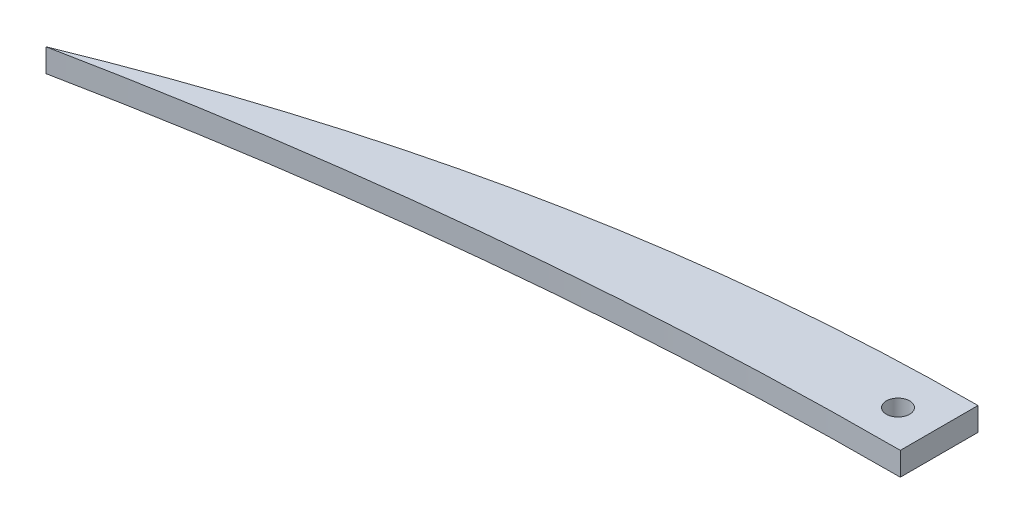
ISO-10303-21;
HEADER;
FILE_DESCRIPTION(('STEP AP214'),'2;1');
FILE_NAME('part.step','',(''),(''),'','','');
FILE_SCHEMA(('AUTOMOTIVE_DESIGN { 1 0 10303 214 1 1 1 1 }'));
ENDSEC;
DATA;
#1=APPLICATION_CONTEXT('core data for automotive mechanical design processes');
#2=APPLICATION_PROTOCOL_DEFINITION('international standard','automotive_design',2000,#1);
#3=PRODUCT_CONTEXT('',#1,'mechanical');
#4=PRODUCT('Part','Part','',(#3));
#5=PRODUCT_RELATED_PRODUCT_CATEGORY('part','',(#4));
#6=PRODUCT_DEFINITION_FORMATION('','',#4);
#7=PRODUCT_DEFINITION_CONTEXT('part definition',#1,'design');
#8=PRODUCT_DEFINITION('design','',#6,#7);
#9=PRODUCT_DEFINITION_SHAPE('','',#8);
#10=(LENGTH_UNIT() NAMED_UNIT(*) SI_UNIT(.MILLI.,.METRE.));
#11=(NAMED_UNIT(*) PLANE_ANGLE_UNIT() SI_UNIT($,.RADIAN.));
#12=(NAMED_UNIT(*) SI_UNIT($,.STERADIAN.) SOLID_ANGLE_UNIT());
#13=UNCERTAINTY_MEASURE_WITH_UNIT(LENGTH_MEASURE(1.E-05),#10,'distance_accuracy_value','');
#14=(GEOMETRIC_REPRESENTATION_CONTEXT(3) GLOBAL_UNCERTAINTY_ASSIGNED_CONTEXT((#13)) GLOBAL_UNIT_ASSIGNED_CONTEXT((#10,
#11,#12)) REPRESENTATION_CONTEXT('',''));
#15=CARTESIAN_POINT('',(0.,0.,0.));
#16=DIRECTION('',(0.,0.,1.));
#17=DIRECTION('',(1.,0.,0.));
#18=AXIS2_PLACEMENT_3D('',#15,#16,#17);
#19=CARTESIAN_POINT('',(0.,3.,0.));
#20=CARTESIAN_POINT('',(49.0098048640722,3.,-20.));
#21=CARTESIAN_POINT('',(100.,3.,-20.));
#22=B_SPLINE_CURVE_WITH_KNOTS('',2,(#19,#20,#21),.UNSPECIFIED.,.F.,.F.,(3,3),(0.,1.),.UNSPECIFIED.);
#23=DIRECTION('',(0.,-1.,0.));
#24=VECTOR('',#23,1.);
#25=SURFACE_OF_LINEAR_EXTRUSION('',#22,#24);
#26=CARTESIAN_POINT('',(0.,0.,0.));
#27=CARTESIAN_POINT('',(49.0098048640722,0.,-20.));
#28=CARTESIAN_POINT('',(100.,0.,-20.));
#29=B_SPLINE_CURVE_WITH_KNOTS('',2,(#26,#27,#28),.UNSPECIFIED.,.F.,.F.,(3,3),(0.,1.),.UNSPECIFIED.);
#30=CARTESIAN_POINT('',(0.,0.,0.));
#31=VERTEX_POINT('',#30);
#32=CARTESIAN_POINT('',(100.,0.,-20.));
#33=VERTEX_POINT('',#32);
#34=EDGE_CURVE('E76',#31,#33,#29,.T.);
#35=ORIENTED_EDGE('',*,*,#34,.F.);
#36=DIRECTION('',(0.,-1.,0.));
#37=VECTOR('',#36,1.);
#38=CARTESIAN_POINT('',(0.,3.,0.));
#39=LINE('',#38,#37);
#40=CARTESIAN_POINT('',(0.,3.,0.));
#41=VERTEX_POINT('',#40);
#42=EDGE_CURVE('E11',#41,#31,#39,.T.);
#43=ORIENTED_EDGE('',*,*,#42,.F.);
#44=CARTESIAN_POINT('',(100.,3.,-20.));
#45=VERTEX_POINT('',#44);
#46=EDGE_CURVE('E74',#41,#45,#22,.T.);
#47=ORIENTED_EDGE('',*,*,#46,.T.);
#48=DIRECTION('',(0.,-1.,0.));
#49=VECTOR('',#48,1.);
#50=CARTESIAN_POINT('',(100.,3.,-20.));
#51=LINE('',#50,#49);
#52=EDGE_CURVE('E70',#45,#33,#51,.T.);
#53=ORIENTED_EDGE('',*,*,#52,.T.);
#54=EDGE_LOOP('',(#35,#43,#47,#53));
#55=FACE_BOUND('',#54,.T.);
#56=ADVANCED_FACE('F35',(#55),#25,.T.);
#57=CARTESIAN_POINT('',(0.,3.,0.));
#58=CARTESIAN_POINT('',(49.7506218943955,3.,-10.));
#59=CARTESIAN_POINT('',(100.,3.,-10.));
#60=B_SPLINE_CURVE_WITH_KNOTS('',2,(#57,#58,#59),.UNSPECIFIED.,.F.,.F.,(3,3),(0.,1.),.UNSPECIFIED.);
#61=DIRECTION('',(0.,-1.,0.));
#62=VECTOR('',#61,1.);
#63=SURFACE_OF_LINEAR_EXTRUSION('',#60,#62);
#64=CARTESIAN_POINT('',(0.,0.,0.));
#65=CARTESIAN_POINT('',(49.7506218943955,0.,-10.));
#66=CARTESIAN_POINT('',(100.,0.,-10.));
#67=B_SPLINE_CURVE_WITH_KNOTS('',2,(#64,#65,#66),.UNSPECIFIED.,.F.,.F.,(3,3),(0.,1.),.UNSPECIFIED.);
#68=CARTESIAN_POINT('',(100.,0.,-10.));
#69=VERTEX_POINT('',#68);
#70=EDGE_CURVE('E64',#31,#69,#67,.T.);
#71=ORIENTED_EDGE('',*,*,#70,.T.);
#72=DIRECTION('',(0.,-1.,0.));
#73=VECTOR('',#72,1.);
#74=CARTESIAN_POINT('',(100.,3.,-10.));
#75=LINE('',#74,#73);
#76=CARTESIAN_POINT('',(100.,3.,-10.));
#77=VERTEX_POINT('',#76);
#78=EDGE_CURVE('E44',#77,#69,#75,.T.);
#79=ORIENTED_EDGE('',*,*,#78,.F.);
#80=EDGE_CURVE('E77',#41,#77,#60,.T.);
#81=ORIENTED_EDGE('',*,*,#80,.F.);
#82=ORIENTED_EDGE('',*,*,#42,.T.);
#83=EDGE_LOOP('',(#71,#79,#81,#82));
#84=FACE_BOUND('',#83,.T.);
#85=ADVANCED_FACE('F78',(#84),#63,.F.);
#86=CARTESIAN_POINT('',(100.,3.,0.));
#87=DIRECTION('',(-1.,0.,0.));
#88=DIRECTION('',(0.,0.,1.));
#89=AXIS2_PLACEMENT_3D('',#86,#87,#88);
#90=PLANE('',#89);
#91=DIRECTION('',(0.,0.,-1.));
#92=VECTOR('',#91,1.);
#93=CARTESIAN_POINT('',(100.,0.,0.));
#94=LINE('',#93,#92);
#95=EDGE_CURVE('E81',#69,#33,#94,.T.);
#96=ORIENTED_EDGE('',*,*,#95,.T.);
#97=ORIENTED_EDGE('',*,*,#52,.F.);
#98=DIRECTION('',(0.,0.,-1.));
#99=VECTOR('',#98,1.);
#100=CARTESIAN_POINT('',(100.,3.,0.));
#101=LINE('',#100,#99);
#102=EDGE_CURVE('E52',#77,#45,#101,.T.);
#103=ORIENTED_EDGE('',*,*,#102,.F.);
#104=ORIENTED_EDGE('',*,*,#78,.T.);
#105=EDGE_LOOP('',(#96,#97,#103,#104));
#106=FACE_BOUND('',#105,.T.);
#107=ADVANCED_FACE('F102',(#106),#90,.F.);
#108=CARTESIAN_POINT('',(0.,3.,0.));
#109=DIRECTION('',(0.,1.,0.));
#110=DIRECTION('',(0.,0.,1.));
#111=AXIS2_PLACEMENT_3D('',#108,#109,#110);
#112=PLANE('',#111);
#113=CARTESIAN_POINT('',(95.0802912487425,3.,-14.6174840511785));
#114=DIRECTION('',(0.,1.,0.));
#115=DIRECTION('',(0.,0.,1.));
#116=AXIS2_PLACEMENT_3D('',#113,#114,#115);
#117=CIRCLE('',#116,1.5);
#118=CARTESIAN_POINT('',(95.0802912487425,3.,-13.1174840511785));
#119=VERTEX_POINT('',#118);
#120=EDGE_CURVE('E87',#119,#119,#117,.T.);
#121=ORIENTED_EDGE('',*,*,#120,.F.);
#122=EDGE_LOOP('',(#121));
#123=FACE_BOUND('',#122,.T.);
#124=ORIENTED_EDGE('',*,*,#46,.F.);
#125=ORIENTED_EDGE('',*,*,#80,.T.);
#126=ORIENTED_EDGE('',*,*,#102,.T.);
#127=EDGE_LOOP('',(#124,#125,#126));
#128=FACE_BOUND('',#127,.T.);
#129=ADVANCED_FACE('F80',(#123,#128),#112,.T.);
#130=CARTESIAN_POINT('',(0.,0.,0.));
#131=DIRECTION('',(0.,1.,0.));
#132=DIRECTION('',(0.,0.,1.));
#133=AXIS2_PLACEMENT_3D('',#130,#131,#132);
#134=PLANE('',#133);
#135=CARTESIAN_POINT('',(95.0802912487425,0.,-14.6174840511785));
#136=DIRECTION('',(0.,1.,0.));
#137=DIRECTION('',(0.,0.,1.));
#138=AXIS2_PLACEMENT_3D('',#135,#136,#137);
#139=CIRCLE('',#138,1.5);
#140=CARTESIAN_POINT('',(95.0802912487425,0.,-13.1174840511785));
#141=VERTEX_POINT('',#140);
#142=EDGE_CURVE('E156',#141,#141,#139,.T.);
#143=ORIENTED_EDGE('',*,*,#142,.T.);
#144=EDGE_LOOP('',(#143));
#145=FACE_BOUND('',#144,.T.);
#146=ORIENTED_EDGE('',*,*,#34,.T.);
#147=ORIENTED_EDGE('',*,*,#95,.F.);
#148=ORIENTED_EDGE('',*,*,#70,.F.);
#149=EDGE_LOOP('',(#146,#147,#148));
#150=FACE_BOUND('',#149,.T.);
#151=ADVANCED_FACE('F106',(#145,#150),#134,.F.);
#152=CARTESIAN_POINT('',(95.0802912487425,0.,-14.6174840511785));
#153=DIRECTION('',(0.,1.,0.));
#154=DIRECTION('',(0.,0.,1.));
#155=AXIS2_PLACEMENT_3D('',#152,#153,#154);
#156=CYLINDRICAL_SURFACE('',#155,1.5);
#157=ORIENTED_EDGE('',*,*,#142,.F.);
#158=EDGE_LOOP('',(#157));
#159=FACE_BOUND('',#158,.T.);
#160=ORIENTED_EDGE('',*,*,#120,.T.);
#161=EDGE_LOOP('',(#160));
#162=FACE_BOUND('',#161,.T.);
#163=ADVANCED_FACE('F109',(#159,#162),#156,.F.);
#164=CLOSED_SHELL('',(#56,#85,#107,#129,#151,#163));
#165=MANIFOLD_SOLID_BREP('B2',#164);
#166=ADVANCED_BREP_SHAPE_REPRESENTATION('',(#18,#165),#14);
#167=SHAPE_DEFINITION_REPRESENTATION(#9,#166);
ENDSEC;
END-ISO-10303-21;
